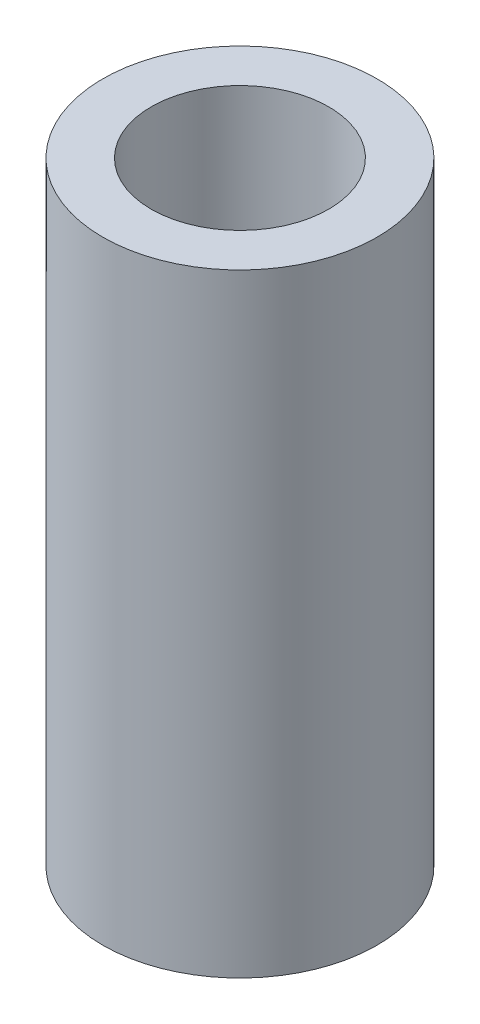
ISO-10303-21;
HEADER;
FILE_DESCRIPTION(('STEP AP214'),'2;1');
FILE_NAME('part.step','',(''),(''),'','','');
FILE_SCHEMA(('AUTOMOTIVE_DESIGN { 1 0 10303 214 1 1 1 1 }'));
ENDSEC;
DATA;
#1=APPLICATION_CONTEXT('core data for automotive mechanical design processes');
#2=APPLICATION_PROTOCOL_DEFINITION('international standard','automotive_design',2000,#1);
#3=PRODUCT_CONTEXT('',#1,'mechanical');
#4=PRODUCT('Part','Part','',(#3));
#5=PRODUCT_RELATED_PRODUCT_CATEGORY('part','',(#4));
#6=PRODUCT_DEFINITION_FORMATION('','',#4);
#7=PRODUCT_DEFINITION_CONTEXT('part definition',#1,'design');
#8=PRODUCT_DEFINITION('design','',#6,#7);
#9=PRODUCT_DEFINITION_SHAPE('','',#8);
#10=(LENGTH_UNIT() NAMED_UNIT(*) SI_UNIT(.MILLI.,.METRE.));
#11=(NAMED_UNIT(*) PLANE_ANGLE_UNIT() SI_UNIT($,.RADIAN.));
#12=(NAMED_UNIT(*) SI_UNIT($,.STERADIAN.) SOLID_ANGLE_UNIT());
#13=UNCERTAINTY_MEASURE_WITH_UNIT(LENGTH_MEASURE(1.E-05),#10,'distance_accuracy_value','');
#14=(GEOMETRIC_REPRESENTATION_CONTEXT(3) GLOBAL_UNCERTAINTY_ASSIGNED_CONTEXT((#13)) GLOBAL_UNIT_ASSIGNED_CONTEXT((#10,
#11,#12)) REPRESENTATION_CONTEXT('',''));
#15=CARTESIAN_POINT('',(0.,0.,0.));
#16=DIRECTION('',(0.,0.,1.));
#17=DIRECTION('',(1.,0.,0.));
#18=AXIS2_PLACEMENT_3D('',#15,#16,#17);
#19=CARTESIAN_POINT('',(0.,19.,0.));
#20=DIRECTION('',(0.,1.,0.));
#21=DIRECTION('',(0.,0.,1.));
#22=AXIS2_PLACEMENT_3D('',#19,#20,#21);
#23=PLANE('',#22);
#24=CARTESIAN_POINT('',(0.,19.,0.));
#25=DIRECTION('',(0.,1.,0.));
#26=DIRECTION('',(0.,0.,1.));
#27=AXIS2_PLACEMENT_3D('',#24,#25,#26);
#28=CIRCLE('',#27,4.25);
#29=CARTESIAN_POINT('',(0.,19.,4.25));
#30=VERTEX_POINT('',#29);
#31=EDGE_CURVE('E10',#30,#30,#28,.T.);
#32=ORIENTED_EDGE('',*,*,#31,.T.);
#33=EDGE_LOOP('',(#32));
#34=FACE_BOUND('',#33,.T.);
#35=CARTESIAN_POINT('',(0.,19.,0.));
#36=DIRECTION('',(0.,1.,0.));
#37=DIRECTION('',(0.,0.,1.));
#38=AXIS2_PLACEMENT_3D('',#35,#36,#37);
#39=CIRCLE('',#38,2.75);
#40=CARTESIAN_POINT('',(0.,19.,2.75));
#41=VERTEX_POINT('',#40);
#42=EDGE_CURVE('E54',#41,#41,#39,.T.);
#43=ORIENTED_EDGE('',*,*,#42,.F.);
#44=EDGE_LOOP('',(#43));
#45=FACE_BOUND('',#44,.T.);
#46=ADVANCED_FACE('F40',(#34,#45),#23,.T.);
#47=CARTESIAN_POINT('',(0.,0.,0.));
#48=DIRECTION('',(0.,1.,0.));
#49=DIRECTION('',(0.,0.,1.));
#50=AXIS2_PLACEMENT_3D('',#47,#48,#49);
#51=PLANE('',#50);
#52=CARTESIAN_POINT('',(0.,0.,0.));
#53=DIRECTION('',(0.,1.,0.));
#54=DIRECTION('',(0.,0.,1.));
#55=AXIS2_PLACEMENT_3D('',#52,#53,#54);
#56=CIRCLE('',#55,4.25);
#57=CARTESIAN_POINT('',(0.,0.,4.25));
#58=VERTEX_POINT('',#57);
#59=EDGE_CURVE('E44',#58,#58,#56,.T.);
#60=ORIENTED_EDGE('',*,*,#59,.F.);
#61=EDGE_LOOP('',(#60));
#62=FACE_BOUND('',#61,.T.);
#63=CARTESIAN_POINT('',(0.,0.,0.));
#64=DIRECTION('',(0.,1.,0.));
#65=DIRECTION('',(0.,0.,1.));
#66=AXIS2_PLACEMENT_3D('',#63,#64,#65);
#67=CIRCLE('',#66,2.75);
#68=CARTESIAN_POINT('',(0.,0.,2.75));
#69=VERTEX_POINT('',#68);
#70=EDGE_CURVE('E56',#69,#69,#67,.T.);
#71=ORIENTED_EDGE('',*,*,#70,.T.);
#72=EDGE_LOOP('',(#71));
#73=FACE_BOUND('',#72,.T.);
#74=ADVANCED_FACE('F67',(#62,#73),#51,.F.);
#75=CARTESIAN_POINT('',(0.,19.,0.));
#76=DIRECTION('',(0.,-1.,0.));
#77=DIRECTION('',(0.,0.,-1.));
#78=AXIS2_PLACEMENT_3D('',#75,#76,#77);
#79=CYLINDRICAL_SURFACE('',#78,4.25);
#80=ORIENTED_EDGE('',*,*,#31,.F.);
#81=EDGE_LOOP('',(#80));
#82=FACE_BOUND('',#81,.T.);
#83=ORIENTED_EDGE('',*,*,#59,.T.);
#84=EDGE_LOOP('',(#83));
#85=FACE_BOUND('',#84,.T.);
#86=ADVANCED_FACE('F42',(#82,#85),#79,.T.);
#87=CARTESIAN_POINT('',(0.,19.,0.));
#88=DIRECTION('',(0.,-1.,0.));
#89=DIRECTION('',(0.,0.,-1.));
#90=AXIS2_PLACEMENT_3D('',#87,#88,#89);
#91=CYLINDRICAL_SURFACE('',#90,2.75);
#92=ORIENTED_EDGE('',*,*,#42,.T.);
#93=EDGE_LOOP('',(#92));
#94=FACE_BOUND('',#93,.T.);
#95=ORIENTED_EDGE('',*,*,#70,.F.);
#96=EDGE_LOOP('',(#95));
#97=FACE_BOUND('',#96,.T.);
#98=ADVANCED_FACE('F63',(#94,#97),#91,.F.);
#99=CLOSED_SHELL('',(#46,#74,#86,#98));
#100=MANIFOLD_SOLID_BREP('B2',#99);
#101=ADVANCED_BREP_SHAPE_REPRESENTATION('',(#18,#100),#14);
#102=SHAPE_DEFINITION_REPRESENTATION(#9,#101);
ENDSEC;
END-ISO-10303-21;
